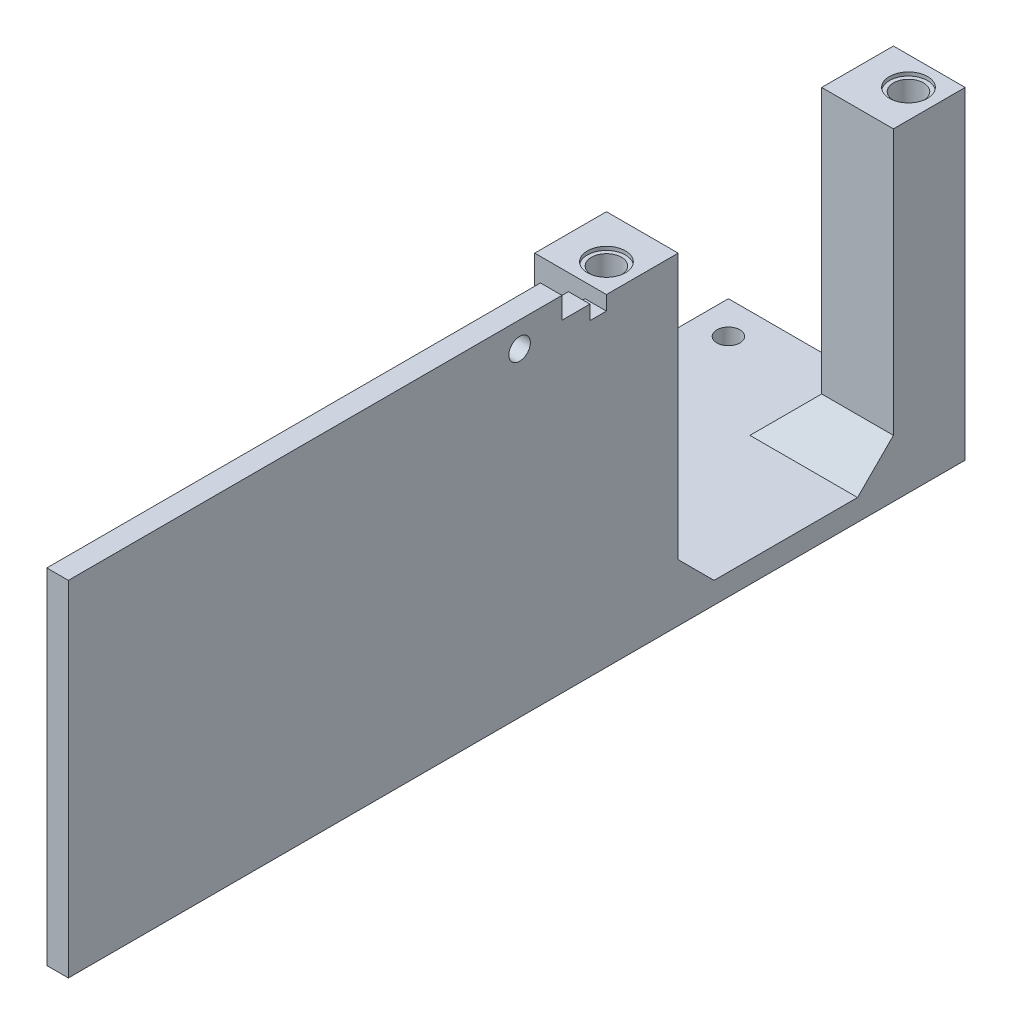
ISO-10303-21;
HEADER;
FILE_DESCRIPTION(('STEP AP214'),'2;1');
FILE_NAME('part.step','',(''),(''),'','','');
FILE_SCHEMA(('AUTOMOTIVE_DESIGN { 1 0 10303 214 1 1 1 1 }'));
ENDSEC;
DATA;
#1=APPLICATION_CONTEXT('core data for automotive mechanical design processes');
#2=APPLICATION_PROTOCOL_DEFINITION('international standard','automotive_design',2000,#1);
#3=PRODUCT_CONTEXT('',#1,'mechanical');
#4=PRODUCT('Part','Part','',(#3));
#5=PRODUCT_RELATED_PRODUCT_CATEGORY('part','',(#4));
#6=PRODUCT_DEFINITION_FORMATION('','',#4);
#7=PRODUCT_DEFINITION_CONTEXT('part definition',#1,'design');
#8=PRODUCT_DEFINITION('design','',#6,#7);
#9=PRODUCT_DEFINITION_SHAPE('','',#8);
#10=(LENGTH_UNIT() NAMED_UNIT(*) SI_UNIT(.MILLI.,.METRE.));
#11=(NAMED_UNIT(*) PLANE_ANGLE_UNIT() SI_UNIT($,.RADIAN.));
#12=(NAMED_UNIT(*) SI_UNIT($,.STERADIAN.) SOLID_ANGLE_UNIT());
#13=UNCERTAINTY_MEASURE_WITH_UNIT(LENGTH_MEASURE(1.E-05),#10,'distance_accuracy_value','');
#14=(GEOMETRIC_REPRESENTATION_CONTEXT(3) GLOBAL_UNCERTAINTY_ASSIGNED_CONTEXT((#13)) GLOBAL_UNIT_ASSIGNED_CONTEXT((#10,
#11,#12)) REPRESENTATION_CONTEXT('',''));
#15=CARTESIAN_POINT('',(0.,0.,0.));
#16=DIRECTION('',(0.,0.,1.));
#17=DIRECTION('',(1.,0.,0.));
#18=AXIS2_PLACEMENT_3D('',#15,#16,#17);
#19=CARTESIAN_POINT('',(26.4876033057851,43.,115.314049586777));
#20=DIRECTION('',(0.,-1.,0.));
#21=DIRECTION('',(0.,0.,-1.));
#22=AXIS2_PLACEMENT_3D('',#19,#20,#21);
#23=PLANE('',#22);
#24=DIRECTION('',(-1.,0.,0.));
#25=VECTOR('',#24,1.);
#26=CARTESIAN_POINT('',(23.4876033057851,43.,42.6140495867769));
#27=LINE('',#26,#25);
#28=CARTESIAN_POINT('',(26.4876033057851,43.,42.6140495867769));
#29=VERTEX_POINT('',#28);
#30=CARTESIAN_POINT('',(23.4876033057851,43.,42.6140495867769));
#31=VERTEX_POINT('',#30);
#32=EDGE_CURVE('E99',#29,#31,#27,.T.);
#33=ORIENTED_EDGE('',*,*,#32,.F.);
#34=DIRECTION('',(0.,0.,-1.));
#35=VECTOR('',#34,1.);
#36=CARTESIAN_POINT('',(26.4876033057851,43.,115.314049586777));
#37=LINE('',#36,#35);
#38=CARTESIAN_POINT('',(26.4876033057851,43.,40.3140495867769));
#39=VERTEX_POINT('',#38);
#40=EDGE_CURVE('E106',#29,#39,#37,.T.);
#41=ORIENTED_EDGE('',*,*,#40,.T.);
#42=DIRECTION('',(-1.,0.,0.));
#43=VECTOR('',#42,1.);
#44=CARTESIAN_POINT('',(26.4876033057851,43.,40.3140495867769));
#45=LINE('',#44,#43);
#46=CARTESIAN_POINT('',(23.4876033057851,43.,40.3140495867769));
#47=VERTEX_POINT('',#46);
#48=EDGE_CURVE('E268',#39,#47,#45,.T.);
#49=ORIENTED_EDGE('',*,*,#48,.T.);
#50=DIRECTION('',(0.,0.,-1.));
#51=VECTOR('',#50,1.);
#52=CARTESIAN_POINT('',(23.4876033057851,43.,115.314049586777));
#53=LINE('',#52,#51);
#54=EDGE_CURVE('E285',#31,#47,#53,.T.);
#55=ORIENTED_EDGE('',*,*,#54,.F.);
#56=EDGE_LOOP('',(#33,#41,#49,#55));
#57=FACE_BOUND('',#56,.T.);
#58=ADVANCED_FACE('F81',(#57),#23,.F.);
#59=CARTESIAN_POINT('',(-6.51239669421487,3.,40.3140495867769));
#60=DIRECTION('',(0.,0.,-1.));
#61=DIRECTION('',(-1.,0.,0.));
#62=AXIS2_PLACEMENT_3D('',#59,#60,#61);
#63=PLANE('',#62);
#64=DIRECTION('',(0.,-1.,0.));
#65=VECTOR('',#64,1.);
#66=CARTESIAN_POINT('',(23.4876033057851,43.,40.3140495867769));
#67=LINE('',#66,#65);
#68=CARTESIAN_POINT('',(23.4876033057851,0.,40.3140495867769));
#69=VERTEX_POINT('',#68);
#70=EDGE_CURVE('E279',#47,#69,#67,.T.);
#71=ORIENTED_EDGE('',*,*,#70,.F.);
#72=ORIENTED_EDGE('',*,*,#48,.F.);
#73=DIRECTION('',(0.,-1.,0.));
#74=VECTOR('',#73,1.);
#75=CARTESIAN_POINT('',(26.4876033057851,3.,40.3140495867769));
#76=LINE('',#75,#74);
#77=CARTESIAN_POINT('',(26.4876033057851,45.,40.3140495867769));
#78=VERTEX_POINT('',#77);
#79=EDGE_CURVE('E393',#78,#39,#76,.T.);
#80=ORIENTED_EDGE('',*,*,#79,.F.);
#81=DIRECTION('',(1.,0.,0.));
#82=VECTOR('',#81,1.);
#83=CARTESIAN_POINT('',(26.4876033057851,45.,40.3140495867769));
#84=LINE('',#83,#82);
#85=CARTESIAN_POINT('',(16.4876033057851,45.,40.3140495867769));
#86=VERTEX_POINT('',#85);
#87=EDGE_CURVE('E340',#86,#78,#84,.T.);
#88=ORIENTED_EDGE('',*,*,#87,.F.);
#89=DIRECTION('',(0.,-1.,0.));
#90=VECTOR('',#89,1.);
#91=CARTESIAN_POINT('',(16.4876033057851,45.,40.3140495867769));
#92=LINE('',#91,#90);
#93=CARTESIAN_POINT('',(16.4876033057851,8.00000000000004,40.3140495867769));
#94=VERTEX_POINT('',#93);
#95=EDGE_CURVE('E343',#86,#94,#92,.T.);
#96=ORIENTED_EDGE('',*,*,#95,.T.);
#97=DIRECTION('',(0.707106781186544,0.707106781186551,0.));
#98=VECTOR('',#97,1.);
#99=CARTESIAN_POINT('',(2.48760330578524,-6.00000000000001,40.3140495867769));
#100=LINE('',#99,#98);
#101=CARTESIAN_POINT('',(11.4876033057852,3.,40.3140495867769));
#102=VERTEX_POINT('',#101);
#103=EDGE_CURVE('E91',#94,#102,#100,.F.);
#104=ORIENTED_EDGE('',*,*,#103,.T.);
#105=DIRECTION('',(1.,0.,0.));
#106=VECTOR('',#105,1.);
#107=CARTESIAN_POINT('',(1.48760330578513,3.,40.3140495867769));
#108=LINE('',#107,#106);
#109=CARTESIAN_POINT('',(-6.51239669421487,3.,40.3140495867769));
#110=VERTEX_POINT('',#109);
#111=EDGE_CURVE('E372',#110,#102,#108,.T.);
#112=ORIENTED_EDGE('',*,*,#111,.F.);
#113=DIRECTION('',(0.,-1.,0.));
#114=VECTOR('',#113,1.);
#115=CARTESIAN_POINT('',(-6.51239669421487,3.,40.3140495867769));
#116=LINE('',#115,#114);
#117=CARTESIAN_POINT('',(-6.51239669421487,0.,40.3140495867769));
#118=VERTEX_POINT('',#117);
#119=EDGE_CURVE('E390',#110,#118,#116,.T.);
#120=ORIENTED_EDGE('',*,*,#119,.T.);
#121=DIRECTION('',(1.,0.,0.));
#122=VECTOR('',#121,1.);
#123=CARTESIAN_POINT('',(-6.51239669421487,0.,40.3140495867769));
#124=LINE('',#123,#122);
#125=EDGE_CURVE('E383',#118,#69,#124,.T.);
#126=ORIENTED_EDGE('',*,*,#125,.T.);
#127=EDGE_LOOP('',(#71,#72,#80,#88,#96,#104,#112,#120,#126));
#128=FACE_BOUND('',#127,.T.);
#129=ADVANCED_FACE('F438',(#128),#63,.F.);
#130=CARTESIAN_POINT('',(22.5376033057851,-7.,-5.73595041322314));
#131=DIRECTION('',(0.,1.,0.));
#132=DIRECTION('',(0.,0.,1.));
#133=AXIS2_PLACEMENT_3D('',#130,#131,#132);
#134=CYLINDRICAL_SURFACE('',#133,2.1);
#135=CARTESIAN_POINT('',(22.5376033057851,44.5,-5.73595041322314));
#136=DIRECTION('',(0.,1.,0.));
#137=DIRECTION('',(0.,0.,1.));
#138=AXIS2_PLACEMENT_3D('',#135,#136,#137);
#139=CIRCLE('',#138,2.1);
#140=CARTESIAN_POINT('',(22.5376033057851,44.5,-3.63595041322314));
#141=VERTEX_POINT('',#140);
#142=EDGE_CURVE('E423',#141,#141,#139,.F.);
#143=ORIENTED_EDGE('',*,*,#142,.F.);
#144=EDGE_LOOP('',(#143));
#145=FACE_BOUND('',#144,.T.);
#146=CARTESIAN_POINT('',(22.5376033057851,0.5,-5.73595041322314));
#147=DIRECTION('',(0.,-1.,0.));
#148=DIRECTION('',(0.,0.,-1.));
#149=AXIS2_PLACEMENT_3D('',#146,#147,#148);
#150=CIRCLE('',#149,2.1);
#151=CARTESIAN_POINT('',(22.5376033057851,0.5,-7.83595041322314));
#152=VERTEX_POINT('',#151);
#153=EDGE_CURVE('E86',#152,#152,#150,.F.);
#154=ORIENTED_EDGE('',*,*,#153,.F.);
#155=EDGE_LOOP('',(#154));
#156=FACE_BOUND('',#155,.T.);
#157=ADVANCED_FACE('F435',(#145,#156),#134,.F.);
#158=CARTESIAN_POINT('',(22.5376033057851,-7.,36.3640495867769));
#159=DIRECTION('',(0.,1.,0.));
#160=DIRECTION('',(0.,0.,1.));
#161=AXIS2_PLACEMENT_3D('',#158,#159,#160);
#162=CYLINDRICAL_SURFACE('',#161,2.1);
#163=CARTESIAN_POINT('',(22.5376033057851,44.5,36.3640495867769));
#164=DIRECTION('',(0.,1.,0.));
#165=DIRECTION('',(0.,0.,1.));
#166=AXIS2_PLACEMENT_3D('',#163,#164,#165);
#167=CIRCLE('',#166,2.1);
#168=CARTESIAN_POINT('',(22.5376033057851,44.5,38.4640495867769));
#169=VERTEX_POINT('',#168);
#170=EDGE_CURVE('E304',#169,#169,#167,.F.);
#171=ORIENTED_EDGE('',*,*,#170,.F.);
#172=EDGE_LOOP('',(#171));
#173=FACE_BOUND('',#172,.T.);
#174=CARTESIAN_POINT('',(22.5376033057851,0.5,36.3640495867769));
#175=DIRECTION('',(0.,-1.,0.));
#176=DIRECTION('',(0.,0.,-1.));
#177=AXIS2_PLACEMENT_3D('',#174,#175,#176);
#178=CIRCLE('',#177,2.1);
#179=CARTESIAN_POINT('',(22.5376033057851,0.5,34.2640495867769));
#180=VERTEX_POINT('',#179);
#181=EDGE_CURVE('E292',#180,#180,#178,.F.);
#182=ORIENTED_EDGE('',*,*,#181,.F.);
#183=EDGE_LOOP('',(#182));
#184=FACE_BOUND('',#183,.T.);
#185=ADVANCED_FACE('F437',(#173,#184),#162,.F.);
#186=CARTESIAN_POINT('',(0.,3.,0.));
#187=DIRECTION('',(0.,-1.,0.));
#188=DIRECTION('',(0.,0.,-1.));
#189=AXIS2_PLACEMENT_3D('',#186,#187,#188);
#190=PLANE('',#189);
#191=CARTESIAN_POINT('',(-1.96239669421488,3.,-5.13595041322314));
#192=DIRECTION('',(0.,1.,0.));
#193=DIRECTION('',(0.,0.,1.));
#194=AXIS2_PLACEMENT_3D('',#191,#192,#193);
#195=CIRCLE('',#194,1.6);
#196=CARTESIAN_POINT('',(-1.96239669421488,3.,-3.53595041322314));
#197=VERTEX_POINT('',#196);
#198=EDGE_CURVE('E359',#197,#197,#195,.T.);
#199=ORIENTED_EDGE('',*,*,#198,.F.);
#200=EDGE_LOOP('',(#199));
#201=FACE_BOUND('',#200,.T.);
#202=CARTESIAN_POINT('',(-1.96239669421487,3.,35.7640495867769));
#203=DIRECTION('',(0.,1.,0.));
#204=DIRECTION('',(0.,0.,1.));
#205=AXIS2_PLACEMENT_3D('',#202,#203,#204);
#206=CIRCLE('',#205,1.6);
#207=CARTESIAN_POINT('',(-1.96239669421487,3.,37.3640495867769));
#208=VERTEX_POINT('',#207);
#209=EDGE_CURVE('E353',#208,#208,#206,.T.);
#210=ORIENTED_EDGE('',*,*,#209,.F.);
#211=EDGE_LOOP('',(#210));
#212=FACE_BOUND('',#211,.T.);
#213=DIRECTION('',(-1.,0.,0.));
#214=VECTOR('',#213,1.);
#215=CARTESIAN_POINT('',(16.4876033057851,3.,5.31404958677684));
#216=LINE('',#215,#214);
#217=CARTESIAN_POINT('',(26.4876033057851,3.,5.31404958677684));
#218=VERTEX_POINT('',#217);
#219=CARTESIAN_POINT('',(11.4876033057851,3.,5.31404958677685));
#220=VERTEX_POINT('',#219);
#221=EDGE_CURVE('E403',#218,#220,#216,.T.);
#222=ORIENTED_EDGE('',*,*,#221,.T.);
#223=DIRECTION('',(0.,0.,-1.));
#224=VECTOR('',#223,1.);
#225=CARTESIAN_POINT('',(11.4876033057851,3.,-9.68595041322314));
#226=LINE('',#225,#224);
#227=CARTESIAN_POINT('',(11.4876033057851,3.,-9.68595041322314));
#228=VERTEX_POINT('',#227);
#229=EDGE_CURVE('E405',#220,#228,#226,.T.);
#230=ORIENTED_EDGE('',*,*,#229,.T.);
#231=DIRECTION('',(1.,0.,0.));
#232=VECTOR('',#231,1.);
#233=CARTESIAN_POINT('',(-6.51239669421488,3.,-9.68595041322314));
#234=LINE('',#233,#232);
#235=CARTESIAN_POINT('',(-6.51239669421488,3.,-9.68595041322314));
#236=VERTEX_POINT('',#235);
#237=EDGE_CURVE('E365',#236,#228,#234,.T.);
#238=ORIENTED_EDGE('',*,*,#237,.F.);
#239=DIRECTION('',(0.,0.,1.));
#240=VECTOR('',#239,1.);
#241=CARTESIAN_POINT('',(-6.51239669421488,3.,-9.68595041322314));
#242=LINE('',#241,#240);
#243=EDGE_CURVE('E375',#236,#110,#242,.T.);
#244=ORIENTED_EDGE('',*,*,#243,.T.);
#245=ORIENTED_EDGE('',*,*,#111,.T.);
#246=DIRECTION('',(0.,0.,-1.));
#247=VECTOR('',#246,1.);
#248=CARTESIAN_POINT('',(11.4876033057852,3.,30.3140495867769));
#249=LINE('',#248,#247);
#250=CARTESIAN_POINT('',(11.4876033057852,3.,25.3140495867769));
#251=VERTEX_POINT('',#250);
#252=EDGE_CURVE('E401',#102,#251,#249,.T.);
#253=ORIENTED_EDGE('',*,*,#252,.T.);
#254=DIRECTION('',(1.,0.,0.));
#255=VECTOR('',#254,1.);
#256=CARTESIAN_POINT('',(26.4876033057851,3.,25.3140495867769));
#257=LINE('',#256,#255);
#258=CARTESIAN_POINT('',(26.4876033057851,3.,25.3140495867769));
#259=VERTEX_POINT('',#258);
#260=EDGE_CURVE('E399',#251,#259,#257,.T.);
#261=ORIENTED_EDGE('',*,*,#260,.T.);
#262=DIRECTION('',(0.,0.,1.));
#263=VECTOR('',#262,1.);
#264=CARTESIAN_POINT('',(26.4876033057851,3.,-9.68595041322314));
#265=LINE('',#264,#263);
#266=EDGE_CURVE('E368',#218,#259,#265,.T.);
#267=ORIENTED_EDGE('',*,*,#266,.F.);
#268=EDGE_LOOP('',(#222,#230,#238,#244,#245,#253,#261,#267));
#269=FACE_BOUND('',#268,.T.);
#270=ADVANCED_FACE('F444',(#201,#212,#269),#190,.F.);
#271=CARTESIAN_POINT('',(0.,0.,0.));
#272=DIRECTION('',(0.,-1.,0.));
#273=DIRECTION('',(0.,0.,-1.));
#274=AXIS2_PLACEMENT_3D('',#271,#272,#273);
#275=PLANE('',#274);
#276=CARTESIAN_POINT('',(22.5376033057851,0.,36.3640495867769));
#277=DIRECTION('',(0.,1.,0.));
#278=DIRECTION('',(0.,0.,1.));
#279=AXIS2_PLACEMENT_3D('',#276,#277,#278);
#280=CIRCLE('',#279,2.65);
#281=CARTESIAN_POINT('',(22.5376033057851,0.,39.0140495867769));
#282=VERTEX_POINT('',#281);
#283=EDGE_CURVE('E293',#282,#282,#280,.T.);
#284=ORIENTED_EDGE('',*,*,#283,.T.);
#285=EDGE_LOOP('',(#284));
#286=FACE_BOUND('',#285,.T.);
#287=CARTESIAN_POINT('',(22.5376033057851,0.,-5.73595041322314));
#288=DIRECTION('',(0.,1.,0.));
#289=DIRECTION('',(0.,0.,1.));
#290=AXIS2_PLACEMENT_3D('',#287,#288,#289);
#291=CIRCLE('',#290,2.65);
#292=CARTESIAN_POINT('',(22.5376033057851,0.,-3.08595041322314));
#293=VERTEX_POINT('',#292);
#294=EDGE_CURVE('E288',#293,#293,#291,.T.);
#295=ORIENTED_EDGE('',*,*,#294,.T.);
#296=EDGE_LOOP('',(#295));
#297=FACE_BOUND('',#296,.T.);
#298=CARTESIAN_POINT('',(-1.96239669421488,0.,-5.13595041322314));
#299=DIRECTION('',(0.,1.,0.));
#300=DIRECTION('',(0.,0.,1.));
#301=AXIS2_PLACEMENT_3D('',#298,#299,#300);
#302=CIRCLE('',#301,1.6);
#303=CARTESIAN_POINT('',(-1.96239669421488,0.,-3.53595041322314));
#304=VERTEX_POINT('',#303);
#305=EDGE_CURVE('E356',#304,#304,#302,.T.);
#306=ORIENTED_EDGE('',*,*,#305,.T.);
#307=EDGE_LOOP('',(#306));
#308=FACE_BOUND('',#307,.T.);
#309=DIRECTION('',(0.,0.,1.));
#310=VECTOR('',#309,1.);
#311=CARTESIAN_POINT('',(-6.51239669421488,0.,-9.68595041322314));
#312=LINE('',#311,#310);
#313=CARTESIAN_POINT('',(-6.51239669421488,0.,-9.68595041322314));
#314=VERTEX_POINT('',#313);
#315=EDGE_CURVE('E369',#314,#118,#312,.T.);
#316=ORIENTED_EDGE('',*,*,#315,.F.);
#317=DIRECTION('',(1.,0.,0.));
#318=VECTOR('',#317,1.);
#319=CARTESIAN_POINT('',(1.48760330578512,0.,-9.68595041322314));
#320=LINE('',#319,#318);
#321=CARTESIAN_POINT('',(26.4876033057851,0.,-9.68595041322314));
#322=VERTEX_POINT('',#321);
#323=EDGE_CURVE('E362',#314,#322,#320,.T.);
#324=ORIENTED_EDGE('',*,*,#323,.T.);
#325=DIRECTION('',(0.,0.,1.));
#326=VECTOR('',#325,1.);
#327=CARTESIAN_POINT('',(26.4876033057851,0.,-9.68595041322314));
#328=LINE('',#327,#326);
#329=CARTESIAN_POINT('',(26.4876033057851,0.,115.314049586777));
#330=VERTEX_POINT('',#329);
#331=EDGE_CURVE('E381',#322,#330,#328,.T.);
#332=ORIENTED_EDGE('',*,*,#331,.T.);
#333=DIRECTION('',(1.,0.,0.));
#334=VECTOR('',#333,1.);
#335=CARTESIAN_POINT('',(26.4876033057851,0.,115.314049586777));
#336=LINE('',#335,#334);
#337=CARTESIAN_POINT('',(23.4876033057851,0.,115.314049586777));
#338=VERTEX_POINT('',#337);
#339=EDGE_CURVE('E233',#338,#330,#336,.T.);
#340=ORIENTED_EDGE('',*,*,#339,.F.);
#341=DIRECTION('',(0.,0.,-1.));
#342=VECTOR('',#341,1.);
#343=CARTESIAN_POINT('',(23.4876033057851,0.,115.314049586777));
#344=LINE('',#343,#342);
#345=EDGE_CURVE('E229',#338,#69,#344,.T.);
#346=ORIENTED_EDGE('',*,*,#345,.T.);
#347=ORIENTED_EDGE('',*,*,#125,.F.);
#348=EDGE_LOOP('',(#316,#324,#332,#340,#346,#347));
#349=FACE_BOUND('',#348,.T.);
#350=CARTESIAN_POINT('',(-1.96239669421487,0.,35.7640495867769));
#351=DIRECTION('',(0.,1.,0.));
#352=DIRECTION('',(0.,0.,1.));
#353=AXIS2_PLACEMENT_3D('',#350,#351,#352);
#354=CIRCLE('',#353,1.6);
#355=CARTESIAN_POINT('',(-1.96239669421487,0.,37.3640495867769));
#356=VERTEX_POINT('',#355);
#357=EDGE_CURVE('E352',#356,#356,#354,.T.);
#358=ORIENTED_EDGE('',*,*,#357,.T.);
#359=EDGE_LOOP('',(#358));
#360=FACE_BOUND('',#359,.T.);
#361=ADVANCED_FACE('F567',(#286,#297,#308,#349,#360),#275,.T.);
#362=CARTESIAN_POINT('',(-6.51239669421488,3.,-9.68595041322314));
#363=DIRECTION('',(1.,0.,0.));
#364=DIRECTION('',(0.,0.,-1.));
#365=AXIS2_PLACEMENT_3D('',#362,#363,#364);
#366=PLANE('',#365);
#367=ORIENTED_EDGE('',*,*,#315,.T.);
#368=ORIENTED_EDGE('',*,*,#119,.F.);
#369=ORIENTED_EDGE('',*,*,#243,.F.);
#370=DIRECTION('',(0.,-1.,0.));
#371=VECTOR('',#370,1.);
#372=CARTESIAN_POINT('',(-6.51239669421488,3.,-9.68595041322314));
#373=LINE('',#372,#371);
#374=EDGE_CURVE('E386',#236,#314,#373,.T.);
#375=ORIENTED_EDGE('',*,*,#374,.T.);
#376=EDGE_LOOP('',(#367,#368,#369,#375));
#377=FACE_BOUND('',#376,.T.);
#378=ADVANCED_FACE('F570',(#377),#366,.F.);
#379=CARTESIAN_POINT('',(26.4876033057851,3.,-9.68595041322314));
#380=DIRECTION('',(1.,0.,0.));
#381=DIRECTION('',(0.,0.,-1.));
#382=AXIS2_PLACEMENT_3D('',#379,#380,#381);
#383=PLANE('',#382);
#384=CARTESIAN_POINT('',(26.4876033057851,44.5,52.4140495867769));
#385=DIRECTION('',(1.,0.,0.));
#386=DIRECTION('',(0.,0.,-1.));
#387=AXIS2_PLACEMENT_3D('',#384,#385,#386);
#388=CIRCLE('',#387,1.5);
#389=CARTESIAN_POINT('',(26.4876033057851,44.5,50.9140495867769));
#390=VERTEX_POINT('',#389);
#391=EDGE_CURVE('E248',#390,#390,#388,.T.);
#392=ORIENTED_EDGE('',*,*,#391,.F.);
#393=EDGE_LOOP('',(#392));
#394=FACE_BOUND('',#393,.T.);
#395=ORIENTED_EDGE('',*,*,#331,.F.);
#396=DIRECTION('',(0.,-1.,0.));
#397=VECTOR('',#396,1.);
#398=CARTESIAN_POINT('',(26.4876033057851,3.,-9.68595041322314));
#399=LINE('',#398,#397);
#400=CARTESIAN_POINT('',(26.4876033057851,45.,-9.68595041322314));
#401=VERTEX_POINT('',#400);
#402=EDGE_CURVE('E378',#401,#322,#399,.T.);
#403=ORIENTED_EDGE('',*,*,#402,.F.);
#404=DIRECTION('',(0.,0.,-1.));
#405=VECTOR('',#404,1.);
#406=CARTESIAN_POINT('',(26.4876033057851,45.,-9.68595041322314));
#407=LINE('',#406,#405);
#408=CARTESIAN_POINT('',(26.4876033057851,45.,0.314049586776862));
#409=VERTEX_POINT('',#408);
#410=EDGE_CURVE('E314',#409,#401,#407,.T.);
#411=ORIENTED_EDGE('',*,*,#410,.F.);
#412=DIRECTION('',(0.,-1.,0.));
#413=VECTOR('',#412,1.);
#414=CARTESIAN_POINT('',(26.4876033057851,45.,0.314049586776862));
#415=LINE('',#414,#413);
#416=CARTESIAN_POINT('',(26.4876033057851,8.00000000000006,0.314049586776862));
#417=VERTEX_POINT('',#416);
#418=EDGE_CURVE('E324',#409,#417,#415,.T.);
#419=ORIENTED_EDGE('',*,*,#418,.T.);
#420=DIRECTION('',(0.,0.707106781186552,-0.707106781186543));
#421=VECTOR('',#420,1.);
#422=CARTESIAN_POINT('',(26.4876033057851,8.00000000000004,0.314049586776862));
#423=LINE('',#422,#421);
#424=EDGE_CURVE('E416',#417,#218,#423,.F.);
#425=ORIENTED_EDGE('',*,*,#424,.T.);
#426=ORIENTED_EDGE('',*,*,#266,.T.);
#427=DIRECTION('',(0.,-0.707106781186551,-0.707106781186544));
#428=VECTOR('',#427,1.);
#429=CARTESIAN_POINT('',(26.4876033057851,8.00000000000003,30.3140495867769));
#430=LINE('',#429,#428);
#431=CARTESIAN_POINT('',(26.4876033057851,8.00000000000004,30.3140495867769));
#432=VERTEX_POINT('',#431);
#433=EDGE_CURVE('E12',#259,#432,#430,.F.);
#434=ORIENTED_EDGE('',*,*,#433,.T.);
#435=DIRECTION('',(0.,-1.,0.));
#436=VECTOR('',#435,1.);
#437=CARTESIAN_POINT('',(26.4876033057851,45.,30.3140495867769));
#438=LINE('',#437,#436);
#439=CARTESIAN_POINT('',(26.4876033057851,45.,30.3140495867769));
#440=VERTEX_POINT('',#439);
#441=EDGE_CURVE('E349',#440,#432,#438,.T.);
#442=ORIENTED_EDGE('',*,*,#441,.F.);
#443=DIRECTION('',(0.,0.,-1.));
#444=VECTOR('',#443,1.);
#445=CARTESIAN_POINT('',(26.4876033057851,45.,40.3140495867769));
#446=LINE('',#445,#444);
#447=EDGE_CURVE('E333',#78,#440,#446,.T.);
#448=ORIENTED_EDGE('',*,*,#447,.F.);
#449=ORIENTED_EDGE('',*,*,#79,.T.);
#450=ORIENTED_EDGE('',*,*,#40,.F.);
#451=DIRECTION('',(0.,-1.,0.));
#452=VECTOR('',#451,1.);
#453=CARTESIAN_POINT('',(26.4876033057851,49.920365840057,42.6140495867769));
#454=LINE('',#453,#452);
#455=CARTESIAN_POINT('',(26.4876033057851,45.,42.6140495867769));
#456=VERTEX_POINT('',#455);
#457=EDGE_CURVE('E264',#456,#29,#454,.T.);
#458=ORIENTED_EDGE('',*,*,#457,.F.);
#459=DIRECTION('',(0.,0.,-1.));
#460=VECTOR('',#459,1.);
#461=CARTESIAN_POINT('',(26.4876033057851,45.,42.6140495867769));
#462=LINE('',#461,#460);
#463=CARTESIAN_POINT('',(26.4876033057851,45.,46.5140495867769));
#464=VERTEX_POINT('',#463);
#465=EDGE_CURVE('E265',#464,#456,#462,.T.);
#466=ORIENTED_EDGE('',*,*,#465,.F.);
#467=DIRECTION('',(0.,-1.,0.));
#468=VECTOR('',#467,1.);
#469=CARTESIAN_POINT('',(26.4876033057851,48.,46.5140495867769));
#470=LINE('',#469,#468);
#471=CARTESIAN_POINT('',(26.4876033057851,48.,46.5140495867769));
#472=VERTEX_POINT('',#471);
#473=EDGE_CURVE('E259',#472,#464,#470,.T.);
#474=ORIENTED_EDGE('',*,*,#473,.F.);
#475=DIRECTION('',(0.,0.,-1.));
#476=VECTOR('',#475,1.);
#477=CARTESIAN_POINT('',(26.4876033057851,48.,115.314049586777));
#478=LINE('',#477,#476);
#479=CARTESIAN_POINT('',(26.4876033057851,48.,115.314049586777));
#480=VERTEX_POINT('',#479);
#481=EDGE_CURVE('E242',#480,#472,#478,.T.);
#482=ORIENTED_EDGE('',*,*,#481,.F.);
#483=DIRECTION('',(0.,1.,0.));
#484=VECTOR('',#483,1.);
#485=CARTESIAN_POINT('',(26.4876033057851,43.,115.314049586777));
#486=LINE('',#485,#484);
#487=EDGE_CURVE('E234',#330,#480,#486,.T.);
#488=ORIENTED_EDGE('',*,*,#487,.F.);
#489=EDGE_LOOP('',(#395,#403,#411,#419,#425,#426,#434,#442,#448,#449,#450,#458,#466,#474,#482,#488));
#490=FACE_BOUND('',#489,.T.);
#491=ADVANCED_FACE('F510',(#394,#490),#383,.T.);
#492=CARTESIAN_POINT('',(1.48760330578512,3.,-9.68595041322314));
#493=DIRECTION('',(0.,0.,-1.));
#494=DIRECTION('',(-1.,0.,0.));
#495=AXIS2_PLACEMENT_3D('',#492,#493,#494);
#496=PLANE('',#495);
#497=ORIENTED_EDGE('',*,*,#323,.F.);
#498=ORIENTED_EDGE('',*,*,#374,.F.);
#499=ORIENTED_EDGE('',*,*,#237,.T.);
#500=DIRECTION('',(-0.707106781186543,-0.707106781186552,0.));
#501=VECTOR('',#500,1.);
#502=CARTESIAN_POINT('',(16.4876033057851,8.00000000000004,-9.68595041322314));
#503=LINE('',#502,#501);
#504=CARTESIAN_POINT('',(16.4876033057851,8.00000000000006,-9.68595041322314));
#505=VERTEX_POINT('',#504);
#506=EDGE_CURVE('E414',#228,#505,#503,.F.);
#507=ORIENTED_EDGE('',*,*,#506,.T.);
#508=DIRECTION('',(0.,-1.,0.));
#509=VECTOR('',#508,1.);
#510=CARTESIAN_POINT('',(16.4876033057851,45.,-9.68595041322314));
#511=LINE('',#510,#509);
#512=CARTESIAN_POINT('',(16.4876033057851,45.,-9.68595041322314));
#513=VERTEX_POINT('',#512);
#514=EDGE_CURVE('E330',#513,#505,#511,.T.);
#515=ORIENTED_EDGE('',*,*,#514,.F.);
#516=DIRECTION('',(-1.,0.,0.));
#517=VECTOR('',#516,1.);
#518=CARTESIAN_POINT('',(26.4876033057851,45.,-9.68595041322314));
#519=LINE('',#518,#517);
#520=EDGE_CURVE('E317',#401,#513,#519,.T.);
#521=ORIENTED_EDGE('',*,*,#520,.F.);
#522=ORIENTED_EDGE('',*,*,#402,.T.);
#523=EDGE_LOOP('',(#497,#498,#499,#507,#515,#521,#522));
#524=FACE_BOUND('',#523,.T.);
#525=ADVANCED_FACE('F513',(#524),#496,.T.);
#526=CARTESIAN_POINT('',(-1.96239669421488,3.,-5.13595041322314));
#527=DIRECTION('',(0.,-1.,0.));
#528=DIRECTION('',(0.,0.,-1.));
#529=AXIS2_PLACEMENT_3D('',#526,#527,#528);
#530=CYLINDRICAL_SURFACE('',#529,1.6);
#531=ORIENTED_EDGE('',*,*,#198,.T.);
#532=EDGE_LOOP('',(#531));
#533=FACE_BOUND('',#532,.T.);
#534=ORIENTED_EDGE('',*,*,#305,.F.);
#535=EDGE_LOOP('',(#534));
#536=FACE_BOUND('',#535,.T.);
#537=ADVANCED_FACE('F557',(#533,#536),#530,.F.);
#538=CARTESIAN_POINT('',(-1.96239669421487,3.,35.7640495867769));
#539=DIRECTION('',(0.,-1.,0.));
#540=DIRECTION('',(0.,0.,-1.));
#541=AXIS2_PLACEMENT_3D('',#538,#539,#540);
#542=CYLINDRICAL_SURFACE('',#541,1.6);
#543=ORIENTED_EDGE('',*,*,#209,.T.);
#544=EDGE_LOOP('',(#543));
#545=FACE_BOUND('',#544,.T.);
#546=ORIENTED_EDGE('',*,*,#357,.F.);
#547=EDGE_LOOP('',(#546));
#548=FACE_BOUND('',#547,.T.);
#549=ADVANCED_FACE('F550',(#545,#548),#542,.F.);
#550=CARTESIAN_POINT('',(26.4876033057851,45.,30.3140495867769));
#551=DIRECTION('',(0.,0.,1.));
#552=DIRECTION('',(1.,0.,0.));
#553=AXIS2_PLACEMENT_3D('',#550,#551,#552);
#554=PLANE('',#553);
#555=ORIENTED_EDGE('',*,*,#441,.T.);
#556=DIRECTION('',(-1.,0.,0.));
#557=VECTOR('',#556,1.);
#558=CARTESIAN_POINT('',(16.4876033057851,8.00000000000003,30.3140495867769));
#559=LINE('',#558,#557);
#560=CARTESIAN_POINT('',(16.4876033057851,8.00000000000004,30.3140495867769));
#561=VERTEX_POINT('',#560);
#562=EDGE_CURVE('E412',#432,#561,#559,.T.);
#563=ORIENTED_EDGE('',*,*,#562,.T.);
#564=DIRECTION('',(0.,-1.,0.));
#565=VECTOR('',#564,1.);
#566=CARTESIAN_POINT('',(16.4876033057851,45.,30.3140495867769));
#567=LINE('',#566,#565);
#568=CARTESIAN_POINT('',(16.4876033057851,45.,30.3140495867769));
#569=VERTEX_POINT('',#568);
#570=EDGE_CURVE('E346',#569,#561,#567,.T.);
#571=ORIENTED_EDGE('',*,*,#570,.F.);
#572=DIRECTION('',(-1.,0.,0.));
#573=VECTOR('',#572,1.);
#574=CARTESIAN_POINT('',(26.4876033057851,45.,30.3140495867769));
#575=LINE('',#574,#573);
#576=EDGE_CURVE('E336',#440,#569,#575,.T.);
#577=ORIENTED_EDGE('',*,*,#576,.F.);
#578=EDGE_LOOP('',(#555,#563,#571,#577));
#579=FACE_BOUND('',#578,.T.);
#580=ADVANCED_FACE('F548',(#579),#554,.F.);
#581=CARTESIAN_POINT('',(16.4876033057851,45.,40.3140495867769));
#582=DIRECTION('',(1.,0.,0.));
#583=DIRECTION('',(0.,0.,-1.));
#584=AXIS2_PLACEMENT_3D('',#581,#582,#583);
#585=PLANE('',#584);
#586=ORIENTED_EDGE('',*,*,#570,.T.);
#587=DIRECTION('',(0.,0.,1.));
#588=VECTOR('',#587,1.);
#589=CARTESIAN_POINT('',(16.4876033057851,8.00000000000003,40.3140495867769));
#590=LINE('',#589,#588);
#591=EDGE_CURVE('E409',#561,#94,#590,.T.);
#592=ORIENTED_EDGE('',*,*,#591,.T.);
#593=ORIENTED_EDGE('',*,*,#95,.F.);
#594=DIRECTION('',(0.,0.,1.));
#595=VECTOR('',#594,1.);
#596=CARTESIAN_POINT('',(16.4876033057851,45.,40.3140495867769));
#597=LINE('',#596,#595);
#598=EDGE_CURVE('E338',#569,#86,#597,.T.);
#599=ORIENTED_EDGE('',*,*,#598,.F.);
#600=EDGE_LOOP('',(#586,#592,#593,#599));
#601=FACE_BOUND('',#600,.T.);
#602=ADVANCED_FACE('F538',(#601),#585,.F.);
#603=CARTESIAN_POINT('',(0.,45.,0.));
#604=DIRECTION('',(0.,1.,0.));
#605=DIRECTION('',(0.,0.,1.));
#606=AXIS2_PLACEMENT_3D('',#603,#604,#605);
#607=PLANE('',#606);
#608=CARTESIAN_POINT('',(22.5376033057851,45.,36.3640495867769));
#609=DIRECTION('',(0.,1.,0.));
#610=DIRECTION('',(0.,0.,1.));
#611=AXIS2_PLACEMENT_3D('',#608,#609,#610);
#612=CIRCLE('',#611,2.65);
#613=CARTESIAN_POINT('',(22.5376033057851,45.,39.0140495867769));
#614=VERTEX_POINT('',#613);
#615=EDGE_CURVE('E305',#614,#614,#612,.T.);
#616=ORIENTED_EDGE('',*,*,#615,.F.);
#617=EDGE_LOOP('',(#616));
#618=FACE_BOUND('',#617,.T.);
#619=ORIENTED_EDGE('',*,*,#447,.T.);
#620=ORIENTED_EDGE('',*,*,#576,.T.);
#621=ORIENTED_EDGE('',*,*,#598,.T.);
#622=ORIENTED_EDGE('',*,*,#87,.T.);
#623=EDGE_LOOP('',(#619,#620,#621,#622));
#624=FACE_BOUND('',#623,.T.);
#625=ADVANCED_FACE('F545',(#618,#624),#607,.T.);
#626=CARTESIAN_POINT('',(16.4876033057851,45.,-9.68595041322314));
#627=DIRECTION('',(1.,0.,0.));
#628=DIRECTION('',(0.,0.,-1.));
#629=AXIS2_PLACEMENT_3D('',#626,#627,#628);
#630=PLANE('',#629);
#631=ORIENTED_EDGE('',*,*,#514,.T.);
#632=DIRECTION('',(0.,0.,1.));
#633=VECTOR('',#632,1.);
#634=CARTESIAN_POINT('',(16.4876033057851,8.00000000000004,0.314049586776863));
#635=LINE('',#634,#633);
#636=CARTESIAN_POINT('',(16.4876033057851,8.00000000000006,0.314049586776863));
#637=VERTEX_POINT('',#636);
#638=EDGE_CURVE('E389',#505,#637,#635,.T.);
#639=ORIENTED_EDGE('',*,*,#638,.T.);
#640=DIRECTION('',(0.,-1.,0.));
#641=VECTOR('',#640,1.);
#642=CARTESIAN_POINT('',(16.4876033057851,45.,0.314049586776863));
#643=LINE('',#642,#641);
#644=CARTESIAN_POINT('',(16.4876033057851,45.,0.314049586776863));
#645=VERTEX_POINT('',#644);
#646=EDGE_CURVE('E327',#645,#637,#643,.T.);
#647=ORIENTED_EDGE('',*,*,#646,.F.);
#648=DIRECTION('',(0.,0.,1.));
#649=VECTOR('',#648,1.);
#650=CARTESIAN_POINT('',(16.4876033057851,45.,-9.68595041322314));
#651=LINE('',#650,#649);
#652=EDGE_CURVE('E320',#513,#645,#651,.T.);
#653=ORIENTED_EDGE('',*,*,#652,.F.);
#654=EDGE_LOOP('',(#631,#639,#647,#653));
#655=FACE_BOUND('',#654,.T.);
#656=ADVANCED_FACE('F519',(#655),#630,.F.);
#657=CARTESIAN_POINT('',(26.4876033057851,45.,0.314049586776862));
#658=DIRECTION('',(0.,0.,-1.));
#659=DIRECTION('',(-1.,0.,0.));
#660=AXIS2_PLACEMENT_3D('',#657,#658,#659);
#661=PLANE('',#660);
#662=ORIENTED_EDGE('',*,*,#646,.T.);
#663=DIRECTION('',(1.,0.,0.));
#664=VECTOR('',#663,1.);
#665=CARTESIAN_POINT('',(26.4876033057851,8.00000000000004,0.314049586776862));
#666=LINE('',#665,#664);
#667=EDGE_CURVE('E407',#637,#417,#666,.T.);
#668=ORIENTED_EDGE('',*,*,#667,.T.);
#669=ORIENTED_EDGE('',*,*,#418,.F.);
#670=DIRECTION('',(1.,0.,0.));
#671=VECTOR('',#670,1.);
#672=CARTESIAN_POINT('',(26.4876033057851,45.,0.314049586776862));
#673=LINE('',#672,#671);
#674=EDGE_CURVE('E322',#645,#409,#673,.T.);
#675=ORIENTED_EDGE('',*,*,#674,.F.);
#676=EDGE_LOOP('',(#662,#668,#669,#675));
#677=FACE_BOUND('',#676,.T.);
#678=ADVANCED_FACE('F502',(#677),#661,.F.);
#679=CARTESIAN_POINT('',(0.,45.,0.));
#680=DIRECTION('',(0.,-1.,0.));
#681=DIRECTION('',(0.,0.,-1.));
#682=AXIS2_PLACEMENT_3D('',#679,#680,#681);
#683=PLANE('',#682);
#684=CARTESIAN_POINT('',(22.5376033057851,45.,-5.73595041322314));
#685=DIRECTION('',(0.,1.,0.));
#686=DIRECTION('',(0.,0.,1.));
#687=AXIS2_PLACEMENT_3D('',#684,#685,#686);
#688=CIRCLE('',#687,2.65);
#689=CARTESIAN_POINT('',(22.5376033057851,45.,-3.08595041322314));
#690=VERTEX_POINT('',#689);
#691=EDGE_CURVE('E311',#690,#690,#688,.T.);
#692=ORIENTED_EDGE('',*,*,#691,.F.);
#693=EDGE_LOOP('',(#692));
#694=FACE_BOUND('',#693,.T.);
#695=ORIENTED_EDGE('',*,*,#410,.T.);
#696=ORIENTED_EDGE('',*,*,#520,.T.);
#697=ORIENTED_EDGE('',*,*,#652,.T.);
#698=ORIENTED_EDGE('',*,*,#674,.T.);
#699=EDGE_LOOP('',(#695,#696,#697,#698));
#700=FACE_BOUND('',#699,.T.);
#701=ADVANCED_FACE('F498',(#694,#700),#683,.F.);
#702=CARTESIAN_POINT('',(26.4876033057851,8.00000000000004,0.314049586776862));
#703=DIRECTION('',(0.,0.707106781186543,0.707106781186552));
#704=DIRECTION('',(-1.,0.,0.));
#705=AXIS2_PLACEMENT_3D('',#702,#703,#704);
#706=PLANE('',#705);
#707=ORIENTED_EDGE('',*,*,#424,.F.);
#708=ORIENTED_EDGE('',*,*,#667,.F.);
#709=DIRECTION('',(-0.577350269189624,-0.57735026918963,0.577350269189623));
#710=VECTOR('',#709,1.);
#711=CARTESIAN_POINT('',(19.8209366391184,11.3333333333334,-3.01928374655645));
#712=LINE('',#711,#710);
#713=EDGE_CURVE('E318',#220,#637,#712,.F.);
#714=ORIENTED_EDGE('',*,*,#713,.F.);
#715=ORIENTED_EDGE('',*,*,#221,.F.);
#716=EDGE_LOOP('',(#707,#708,#714,#715));
#717=FACE_BOUND('',#716,.T.);
#718=ADVANCED_FACE('F501',(#717),#706,.T.);
#719=CARTESIAN_POINT('',(16.4876033057851,8.00000000000004,-9.68595041322314));
#720=DIRECTION('',(-0.707106781186552,0.707106781186543,0.));
#721=DIRECTION('',(0.,0.,-1.));
#722=AXIS2_PLACEMENT_3D('',#719,#720,#721);
#723=PLANE('',#722);
#724=ORIENTED_EDGE('',*,*,#506,.F.);
#725=ORIENTED_EDGE('',*,*,#229,.F.);
#726=ORIENTED_EDGE('',*,*,#713,.T.);
#727=ORIENTED_EDGE('',*,*,#638,.F.);
#728=EDGE_LOOP('',(#724,#725,#726,#727));
#729=FACE_BOUND('',#728,.T.);
#730=ADVANCED_FACE('F581',(#729),#723,.T.);
#731=CARTESIAN_POINT('',(26.4876033057851,8.00000000000003,30.3140495867769));
#732=DIRECTION('',(0.,0.707106781186544,-0.707106781186551));
#733=DIRECTION('',(1.,0.,0.));
#734=AXIS2_PLACEMENT_3D('',#731,#732,#733);
#735=PLANE('',#734);
#736=ORIENTED_EDGE('',*,*,#433,.F.);
#737=ORIENTED_EDGE('',*,*,#260,.F.);
#738=DIRECTION('',(0.577350269189624,0.57735026918963,0.577350269189624));
#739=VECTOR('',#738,1.);
#740=CARTESIAN_POINT('',(19.8209366391184,11.3333333333334,33.6473829201102));
#741=LINE('',#740,#739);
#742=EDGE_CURVE('E420',#561,#251,#741,.F.);
#743=ORIENTED_EDGE('',*,*,#742,.F.);
#744=ORIENTED_EDGE('',*,*,#562,.F.);
#745=EDGE_LOOP('',(#736,#737,#743,#744));
#746=FACE_BOUND('',#745,.T.);
#747=ADVANCED_FACE('F84',(#746),#735,.T.);
#748=CARTESIAN_POINT('',(16.4876033057851,8.00000000000003,40.3140495867769));
#749=DIRECTION('',(-0.707106781186551,0.707106781186544,0.));
#750=DIRECTION('',(0.,0.,-1.));
#751=AXIS2_PLACEMENT_3D('',#748,#749,#750);
#752=PLANE('',#751);
#753=ORIENTED_EDGE('',*,*,#742,.T.);
#754=ORIENTED_EDGE('',*,*,#252,.F.);
#755=ORIENTED_EDGE('',*,*,#103,.F.);
#756=ORIENTED_EDGE('',*,*,#591,.F.);
#757=EDGE_LOOP('',(#753,#754,#755,#756));
#758=FACE_BOUND('',#757,.T.);
#759=ADVANCED_FACE('F481',(#758),#752,.T.);
#760=CARTESIAN_POINT('',(22.5376033057851,44.5,36.3640495867769));
#761=DIRECTION('',(0.,1.,0.));
#762=DIRECTION('',(0.,0.,1.));
#763=AXIS2_PLACEMENT_3D('',#760,#761,#762);
#764=PLANE('',#763);
#765=CARTESIAN_POINT('',(22.5376033057851,44.5,36.3640495867769));
#766=DIRECTION('',(0.,1.,0.));
#767=DIRECTION('',(0.,0.,1.));
#768=AXIS2_PLACEMENT_3D('',#765,#766,#767);
#769=CIRCLE('',#768,2.65);
#770=CARTESIAN_POINT('',(22.5376033057851,44.5,39.0140495867769));
#771=VERTEX_POINT('',#770);
#772=EDGE_CURVE('E301',#771,#771,#769,.T.);
#773=ORIENTED_EDGE('',*,*,#772,.T.);
#774=EDGE_LOOP('',(#773));
#775=FACE_BOUND('',#774,.T.);
#776=ORIENTED_EDGE('',*,*,#170,.T.);
#777=EDGE_LOOP('',(#776));
#778=FACE_BOUND('',#777,.T.);
#779=ADVANCED_FACE('F477',(#775,#778),#764,.T.);
#780=CARTESIAN_POINT('',(22.5376033057851,44.5,36.3640495867769));
#781=DIRECTION('',(0.,1.,0.));
#782=DIRECTION('',(0.,0.,1.));
#783=AXIS2_PLACEMENT_3D('',#780,#781,#782);
#784=CYLINDRICAL_SURFACE('',#783,2.65);
#785=ORIENTED_EDGE('',*,*,#772,.F.);
#786=EDGE_LOOP('',(#785));
#787=FACE_BOUND('',#786,.T.);
#788=ORIENTED_EDGE('',*,*,#615,.T.);
#789=EDGE_LOOP('',(#788));
#790=FACE_BOUND('',#789,.T.);
#791=ADVANCED_FACE('F480',(#787,#790),#784,.F.);
#792=CARTESIAN_POINT('',(22.5376033057851,44.5,-5.73595041322314));
#793=DIRECTION('',(0.,1.,0.));
#794=DIRECTION('',(0.,0.,1.));
#795=AXIS2_PLACEMENT_3D('',#792,#793,#794);
#796=PLANE('',#795);
#797=CARTESIAN_POINT('',(22.5376033057851,44.5,-5.73595041322314));
#798=DIRECTION('',(0.,1.,0.));
#799=DIRECTION('',(0.,0.,1.));
#800=AXIS2_PLACEMENT_3D('',#797,#798,#799);
#801=CIRCLE('',#800,2.65);
#802=CARTESIAN_POINT('',(22.5376033057851,44.5,-3.08595041322314));
#803=VERTEX_POINT('',#802);
#804=EDGE_CURVE('E308',#803,#803,#801,.T.);
#805=ORIENTED_EDGE('',*,*,#804,.T.);
#806=EDGE_LOOP('',(#805));
#807=FACE_BOUND('',#806,.T.);
#808=ORIENTED_EDGE('',*,*,#142,.T.);
#809=EDGE_LOOP('',(#808));
#810=FACE_BOUND('',#809,.T.);
#811=ADVANCED_FACE('F485',(#807,#810),#796,.T.);
#812=CARTESIAN_POINT('',(22.5376033057851,44.5,-5.73595041322314));
#813=DIRECTION('',(0.,1.,0.));
#814=DIRECTION('',(0.,0.,1.));
#815=AXIS2_PLACEMENT_3D('',#812,#813,#814);
#816=CYLINDRICAL_SURFACE('',#815,2.65);
#817=ORIENTED_EDGE('',*,*,#804,.F.);
#818=EDGE_LOOP('',(#817));
#819=FACE_BOUND('',#818,.T.);
#820=ORIENTED_EDGE('',*,*,#691,.T.);
#821=EDGE_LOOP('',(#820));
#822=FACE_BOUND('',#821,.T.);
#823=ADVANCED_FACE('F472',(#819,#822),#816,.F.);
#824=CARTESIAN_POINT('',(22.5376033057851,0.5,-5.73595041322314));
#825=DIRECTION('',(0.,-1.,0.));
#826=DIRECTION('',(0.,0.,1.));
#827=AXIS2_PLACEMENT_3D('',#824,#825,#826);
#828=PLANE('',#827);
#829=CARTESIAN_POINT('',(22.5376033057851,0.5,-5.73595041322314));
#830=DIRECTION('',(0.,1.,0.));
#831=DIRECTION('',(0.,0.,1.));
#832=AXIS2_PLACEMENT_3D('',#829,#830,#831);
#833=CIRCLE('',#832,2.65);
#834=CARTESIAN_POINT('',(22.5376033057851,0.5,-3.08595041322314));
#835=VERTEX_POINT('',#834);
#836=EDGE_CURVE('E296',#835,#835,#833,.T.);
#837=ORIENTED_EDGE('',*,*,#836,.F.);
#838=EDGE_LOOP('',(#837));
#839=FACE_BOUND('',#838,.T.);
#840=ORIENTED_EDGE('',*,*,#153,.T.);
#841=EDGE_LOOP('',(#840));
#842=FACE_BOUND('',#841,.T.);
#843=ADVANCED_FACE('F433',(#839,#842),#828,.T.);
#844=CARTESIAN_POINT('',(22.5376033057851,0.5,-5.73595041322314));
#845=DIRECTION('',(0.,-1.,0.));
#846=DIRECTION('',(0.,0.,-1.));
#847=AXIS2_PLACEMENT_3D('',#844,#845,#846);
#848=CYLINDRICAL_SURFACE('',#847,2.65);
#849=ORIENTED_EDGE('',*,*,#836,.T.);
#850=EDGE_LOOP('',(#849));
#851=FACE_BOUND('',#850,.T.);
#852=ORIENTED_EDGE('',*,*,#294,.F.);
#853=EDGE_LOOP('',(#852));
#854=FACE_BOUND('',#853,.T.);
#855=ADVANCED_FACE('F465',(#851,#854),#848,.F.);
#856=CARTESIAN_POINT('',(22.5376033057851,0.5,36.3640495867769));
#857=DIRECTION('',(0.,-1.,0.));
#858=DIRECTION('',(0.,0.,1.));
#859=AXIS2_PLACEMENT_3D('',#856,#857,#858);
#860=PLANE('',#859);
#861=CARTESIAN_POINT('',(22.5376033057851,0.5,36.3640495867769));
#862=DIRECTION('',(0.,1.,0.));
#863=DIRECTION('',(0.,0.,1.));
#864=AXIS2_PLACEMENT_3D('',#861,#862,#863);
#865=CIRCLE('',#864,2.65);
#866=CARTESIAN_POINT('',(22.5376033057851,0.5,39.0140495867769));
#867=VERTEX_POINT('',#866);
#868=EDGE_CURVE('E289',#867,#867,#865,.T.);
#869=ORIENTED_EDGE('',*,*,#868,.F.);
#870=EDGE_LOOP('',(#869));
#871=FACE_BOUND('',#870,.T.);
#872=ORIENTED_EDGE('',*,*,#181,.T.);
#873=EDGE_LOOP('',(#872));
#874=FACE_BOUND('',#873,.T.);
#875=ADVANCED_FACE('F461',(#871,#874),#860,.T.);
#876=CARTESIAN_POINT('',(22.5376033057851,0.5,36.3640495867769));
#877=DIRECTION('',(0.,-1.,0.));
#878=DIRECTION('',(0.,0.,-1.));
#879=AXIS2_PLACEMENT_3D('',#876,#877,#878);
#880=CYLINDRICAL_SURFACE('',#879,2.65);
#881=ORIENTED_EDGE('',*,*,#868,.T.);
#882=EDGE_LOOP('',(#881));
#883=FACE_BOUND('',#882,.T.);
#884=ORIENTED_EDGE('',*,*,#283,.F.);
#885=EDGE_LOOP('',(#884));
#886=FACE_BOUND('',#885,.T.);
#887=ADVANCED_FACE('F464',(#883,#886),#880,.F.);
#888=CARTESIAN_POINT('',(23.4876033057851,43.,115.314049586777));
#889=DIRECTION('',(1.,0.,0.));
#890=DIRECTION('',(0.,1.,0.));
#891=AXIS2_PLACEMENT_3D('',#888,#889,#890);
#892=PLANE('',#891);
#893=CARTESIAN_POINT('',(23.4876033057851,44.5,52.4140495867769));
#894=DIRECTION('',(-1.,0.,0.));
#895=DIRECTION('',(0.,-1.,0.));
#896=AXIS2_PLACEMENT_3D('',#893,#894,#895);
#897=CIRCLE('',#896,1.5);
#898=CARTESIAN_POINT('',(23.4876033057851,43.,52.4140495867769));
#899=VERTEX_POINT('',#898);
#900=EDGE_CURVE('E251',#899,#899,#897,.T.);
#901=ORIENTED_EDGE('',*,*,#900,.F.);
#902=EDGE_LOOP('',(#901));
#903=FACE_BOUND('',#902,.T.);
#904=ORIENTED_EDGE('',*,*,#70,.T.);
#905=ORIENTED_EDGE('',*,*,#345,.F.);
#906=DIRECTION('',(0.,-1.,0.));
#907=VECTOR('',#906,1.);
#908=CARTESIAN_POINT('',(23.4876033057851,43.,115.314049586777));
#909=LINE('',#908,#907);
#910=CARTESIAN_POINT('',(23.4876033057851,48.,115.314049586777));
#911=VERTEX_POINT('',#910);
#912=EDGE_CURVE('E221',#911,#338,#909,.T.);
#913=ORIENTED_EDGE('',*,*,#912,.F.);
#914=DIRECTION('',(0.,0.,1.));
#915=VECTOR('',#914,1.);
#916=CARTESIAN_POINT('',(23.4876033057851,48.,115.314049586777));
#917=LINE('',#916,#915);
#918=CARTESIAN_POINT('',(23.4876033057851,48.,46.5140495867769));
#919=VERTEX_POINT('',#918);
#920=EDGE_CURVE('E227',#919,#911,#917,.T.);
#921=ORIENTED_EDGE('',*,*,#920,.F.);
#922=DIRECTION('',(0.,-1.,0.));
#923=VECTOR('',#922,1.);
#924=CARTESIAN_POINT('',(23.4876033057851,48.,46.5140495867769));
#925=LINE('',#924,#923);
#926=CARTESIAN_POINT('',(23.4876033057851,45.,46.5140495867769));
#927=VERTEX_POINT('',#926);
#928=EDGE_CURVE('E257',#919,#927,#925,.T.);
#929=ORIENTED_EDGE('',*,*,#928,.T.);
#930=DIRECTION('',(0.,0.,1.));
#931=VECTOR('',#930,1.);
#932=CARTESIAN_POINT('',(23.4876033057851,45.,42.6140495867769));
#933=LINE('',#932,#931);
#934=CARTESIAN_POINT('',(23.4876033057851,45.,42.6140495867769));
#935=VERTEX_POINT('',#934);
#936=EDGE_CURVE('E272',#935,#927,#933,.T.);
#937=ORIENTED_EDGE('',*,*,#936,.F.);
#938=DIRECTION('',(0.,-1.,0.));
#939=VECTOR('',#938,1.);
#940=CARTESIAN_POINT('',(23.4876033057851,49.920365840057,42.6140495867769));
#941=LINE('',#940,#939);
#942=EDGE_CURVE('E261',#935,#31,#941,.T.);
#943=ORIENTED_EDGE('',*,*,#942,.T.);
#944=ORIENTED_EDGE('',*,*,#54,.T.);
#945=EDGE_LOOP('',(#904,#905,#913,#921,#929,#937,#943,#944));
#946=FACE_BOUND('',#945,.T.);
#947=ADVANCED_FACE('F224',(#903,#946),#892,.F.);
#948=CARTESIAN_POINT('',(0.,0.,115.314049586777));
#949=DIRECTION('',(0.,0.,-1.));
#950=DIRECTION('',(-1.,0.,0.));
#951=AXIS2_PLACEMENT_3D('',#948,#949,#950);
#952=PLANE('',#951);
#953=ORIENTED_EDGE('',*,*,#487,.T.);
#954=DIRECTION('',(1.,0.,0.));
#955=VECTOR('',#954,1.);
#956=CARTESIAN_POINT('',(23.4876033057851,48.,115.314049586777));
#957=LINE('',#956,#955);
#958=EDGE_CURVE('E237',#911,#480,#957,.T.);
#959=ORIENTED_EDGE('',*,*,#958,.F.);
#960=ORIENTED_EDGE('',*,*,#912,.T.);
#961=ORIENTED_EDGE('',*,*,#339,.T.);
#962=EDGE_LOOP('',(#953,#959,#960,#961));
#963=FACE_BOUND('',#962,.T.);
#964=ADVANCED_FACE('F238',(#963),#952,.F.);
#965=CARTESIAN_POINT('',(23.4876033057851,49.920365840057,42.6140495867769));
#966=DIRECTION('',(0.,0.,1.));
#967=DIRECTION('',(1.,0.,0.));
#968=AXIS2_PLACEMENT_3D('',#965,#966,#967);
#969=PLANE('',#968);
#970=DIRECTION('',(-1.,0.,0.));
#971=VECTOR('',#970,1.);
#972=CARTESIAN_POINT('',(23.4876033057851,45.,42.6140495867769));
#973=LINE('',#972,#971);
#974=EDGE_CURVE('E263',#456,#935,#973,.T.);
#975=ORIENTED_EDGE('',*,*,#974,.F.);
#976=ORIENTED_EDGE('',*,*,#457,.T.);
#977=ORIENTED_EDGE('',*,*,#32,.T.);
#978=ORIENTED_EDGE('',*,*,#942,.F.);
#979=EDGE_LOOP('',(#975,#976,#977,#978));
#980=FACE_BOUND('',#979,.T.);
#981=ADVANCED_FACE('F719',(#980),#969,.F.);
#982=CARTESIAN_POINT('',(0.,45.,0.));
#983=DIRECTION('',(0.,1.,0.));
#984=DIRECTION('',(0.,0.,1.));
#985=AXIS2_PLACEMENT_3D('',#982,#983,#984);
#986=PLANE('',#985);
#987=ORIENTED_EDGE('',*,*,#974,.T.);
#988=ORIENTED_EDGE('',*,*,#936,.T.);
#989=DIRECTION('',(1.,0.,0.));
#990=VECTOR('',#989,1.);
#991=CARTESIAN_POINT('',(23.4876033057851,45.,46.5140495867769));
#992=LINE('',#991,#990);
#993=EDGE_CURVE('E269',#927,#464,#992,.T.);
#994=ORIENTED_EDGE('',*,*,#993,.T.);
#995=ORIENTED_EDGE('',*,*,#465,.T.);
#996=EDGE_LOOP('',(#987,#988,#994,#995));
#997=FACE_BOUND('',#996,.T.);
#998=ADVANCED_FACE('F731',(#997),#986,.T.);
#999=CARTESIAN_POINT('',(23.4876033057851,48.,46.5140495867769));
#1000=DIRECTION('',(0.,0.,1.));
#1001=DIRECTION('',(1.,0.,0.));
#1002=AXIS2_PLACEMENT_3D('',#999,#1000,#1001);
#1003=PLANE('',#1002);
#1004=ORIENTED_EDGE('',*,*,#993,.F.);
#1005=ORIENTED_EDGE('',*,*,#928,.F.);
#1006=DIRECTION('',(-1.,0.,0.));
#1007=VECTOR('',#1006,1.);
#1008=CARTESIAN_POINT('',(23.4876033057851,48.,46.5140495867769));
#1009=LINE('',#1008,#1007);
#1010=EDGE_CURVE('E246',#472,#919,#1009,.T.);
#1011=ORIENTED_EDGE('',*,*,#1010,.F.);
#1012=ORIENTED_EDGE('',*,*,#473,.T.);
#1013=EDGE_LOOP('',(#1004,#1005,#1011,#1012));
#1014=FACE_BOUND('',#1013,.T.);
#1015=ADVANCED_FACE('F743',(#1014),#1003,.F.);
#1016=CARTESIAN_POINT('',(0.,48.,0.));
#1017=DIRECTION('',(0.,-1.,0.));
#1018=DIRECTION('',(0.,0.,-1.));
#1019=AXIS2_PLACEMENT_3D('',#1016,#1017,#1018);
#1020=PLANE('',#1019);
#1021=ORIENTED_EDGE('',*,*,#920,.T.);
#1022=ORIENTED_EDGE('',*,*,#958,.T.);
#1023=ORIENTED_EDGE('',*,*,#481,.T.);
#1024=ORIENTED_EDGE('',*,*,#1010,.T.);
#1025=EDGE_LOOP('',(#1021,#1022,#1023,#1024));
#1026=FACE_BOUND('',#1025,.T.);
#1027=ADVANCED_FACE('F244',(#1026),#1020,.F.);
#1028=CARTESIAN_POINT('',(28.4876033057851,44.5,52.4140495867769));
#1029=DIRECTION('',(-1.,0.,0.));
#1030=DIRECTION('',(0.,-1.,0.));
#1031=AXIS2_PLACEMENT_3D('',#1028,#1029,#1030);
#1032=CYLINDRICAL_SURFACE('',#1031,1.5);
#1033=ORIENTED_EDGE('',*,*,#391,.T.);
#1034=EDGE_LOOP('',(#1033));
#1035=FACE_BOUND('',#1034,.T.);
#1036=ORIENTED_EDGE('',*,*,#900,.T.);
#1037=EDGE_LOOP('',(#1036));
#1038=FACE_BOUND('',#1037,.T.);
#1039=ADVANCED_FACE('F761',(#1035,#1038),#1032,.F.);
#1040=CLOSED_SHELL('',(#58,#129,#157,#185,#270,#361,#378,#491,#525,#537,#549,#580,#602,#625,
#656,#678,#701,#718,#730,#747,#759,#779,#791,#811,#823,#843,#855,#875,#887,#947,#964,#981,#998,
#1015,#1027,#1039));
#1041=MANIFOLD_SOLID_BREP('B2',#1040);
#1042=ADVANCED_BREP_SHAPE_REPRESENTATION('',(#18,#1041),#14);
#1043=SHAPE_DEFINITION_REPRESENTATION(#9,#1042);
ENDSEC;
END-ISO-10303-21;
